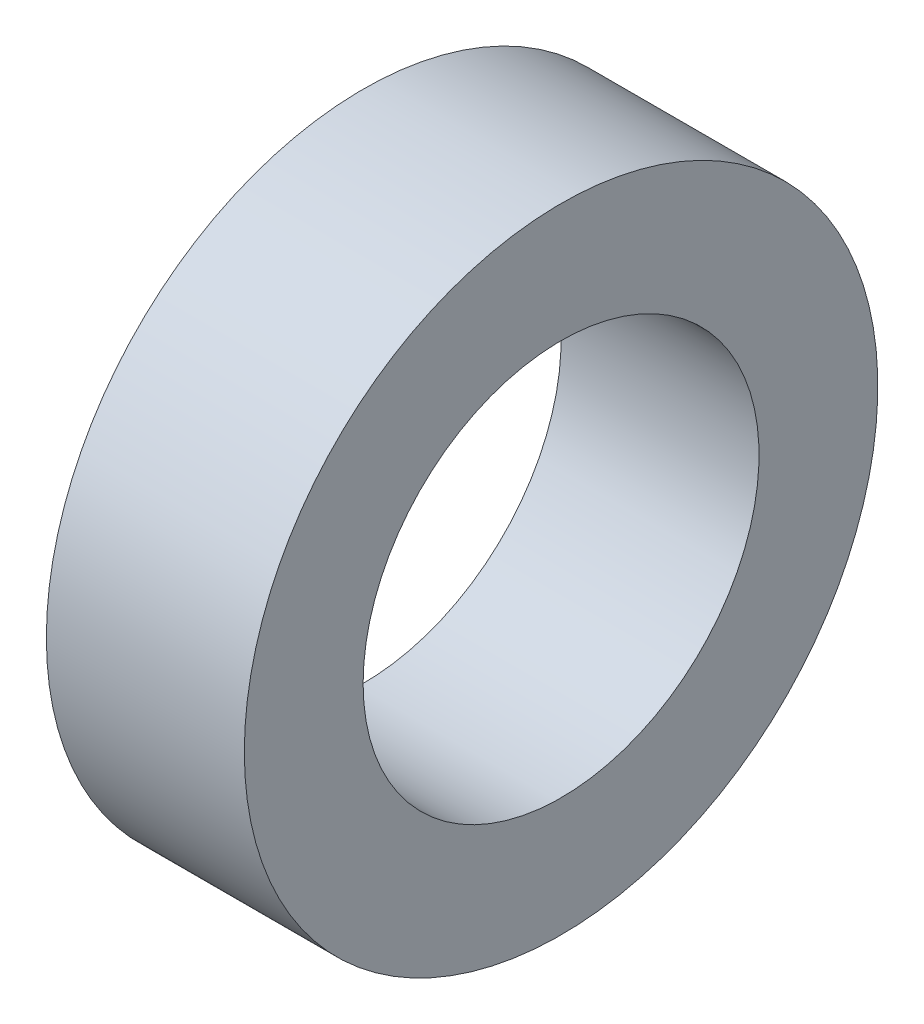
ISO-10303-21;
HEADER;
FILE_DESCRIPTION(('STEP AP214'),'2;1');
FILE_NAME('part.step','',(''),(''),'','','');
FILE_SCHEMA(('AUTOMOTIVE_DESIGN { 1 0 10303 214 1 1 1 1 }'));
ENDSEC;
DATA;
#1=APPLICATION_CONTEXT('core data for automotive mechanical design processes');
#2=APPLICATION_PROTOCOL_DEFINITION('international standard','automotive_design',2000,#1);
#3=PRODUCT_CONTEXT('',#1,'mechanical');
#4=PRODUCT('Part','Part','',(#3));
#5=PRODUCT_RELATED_PRODUCT_CATEGORY('part','',(#4));
#6=PRODUCT_DEFINITION_FORMATION('','',#4);
#7=PRODUCT_DEFINITION_CONTEXT('part definition',#1,'design');
#8=PRODUCT_DEFINITION('design','',#6,#7);
#9=PRODUCT_DEFINITION_SHAPE('','',#8);
#10=(LENGTH_UNIT() NAMED_UNIT(*) SI_UNIT(.MILLI.,.METRE.));
#11=(NAMED_UNIT(*) PLANE_ANGLE_UNIT() SI_UNIT($,.RADIAN.));
#12=(NAMED_UNIT(*) SI_UNIT($,.STERADIAN.) SOLID_ANGLE_UNIT());
#13=UNCERTAINTY_MEASURE_WITH_UNIT(LENGTH_MEASURE(1.E-05),#10,'distance_accuracy_value','');
#14=(GEOMETRIC_REPRESENTATION_CONTEXT(3) GLOBAL_UNCERTAINTY_ASSIGNED_CONTEXT((#13)) GLOBAL_UNIT_ASSIGNED_CONTEXT((#10,
#11,#12)) REPRESENTATION_CONTEXT('',''));
#15=CARTESIAN_POINT('',(0.,0.,0.));
#16=DIRECTION('',(0.,0.,1.));
#17=DIRECTION('',(1.,0.,0.));
#18=AXIS2_PLACEMENT_3D('',#15,#16,#17);
#19=CARTESIAN_POINT('',(0.,2.5,0.));
#20=DIRECTION('',(1.,0.,0.));
#21=DIRECTION('',(0.,0.,-1.));
#22=AXIS2_PLACEMENT_3D('',#19,#20,#21);
#23=PLANE('',#22);
#24=CARTESIAN_POINT('',(0.,0.,0.));
#25=DIRECTION('',(-1.,0.,0.));
#26=DIRECTION('',(0.,0.,1.));
#27=AXIS2_PLACEMENT_3D('',#24,#25,#26);
#28=CIRCLE('',#27,2.5);
#29=CARTESIAN_POINT('',(0.,0.,2.5));
#30=VERTEX_POINT('',#29);
#31=EDGE_CURVE('E49',#30,#30,#28,.T.);
#32=ORIENTED_EDGE('',*,*,#31,.F.);
#33=EDGE_LOOP('',(#32));
#34=FACE_BOUND('',#33,.T.);
#35=CARTESIAN_POINT('',(0.,0.,0.));
#36=DIRECTION('',(-1.,0.,0.));
#37=DIRECTION('',(0.,0.,1.));
#38=AXIS2_PLACEMENT_3D('',#35,#36,#37);
#39=CIRCLE('',#38,4.);
#40=CARTESIAN_POINT('',(0.,0.,4.));
#41=VERTEX_POINT('',#40);
#42=EDGE_CURVE('E10',#41,#41,#39,.T.);
#43=ORIENTED_EDGE('',*,*,#42,.T.);
#44=EDGE_LOOP('',(#43));
#45=FACE_BOUND('',#44,.T.);
#46=ADVANCED_FACE('F35',(#34,#45),#23,.F.);
#47=CARTESIAN_POINT('',(0.,0.,0.));
#48=DIRECTION('',(-1.,0.,0.));
#49=DIRECTION('',(0.,0.,1.));
#50=AXIS2_PLACEMENT_3D('',#47,#48,#49);
#51=CYLINDRICAL_SURFACE('',#50,4.);
#52=ORIENTED_EDGE('',*,*,#42,.F.);
#53=EDGE_LOOP('',(#52));
#54=FACE_BOUND('',#53,.T.);
#55=CARTESIAN_POINT('',(2.5,0.,0.));
#56=DIRECTION('',(-1.,0.,0.));
#57=DIRECTION('',(0.,0.,1.));
#58=AXIS2_PLACEMENT_3D('',#55,#56,#57);
#59=CIRCLE('',#58,4.);
#60=CARTESIAN_POINT('',(2.5,0.,4.));
#61=VERTEX_POINT('',#60);
#62=EDGE_CURVE('E41',#61,#61,#59,.T.);
#63=ORIENTED_EDGE('',*,*,#62,.T.);
#64=EDGE_LOOP('',(#63));
#65=FACE_BOUND('',#64,.T.);
#66=ADVANCED_FACE('F58',(#54,#65),#51,.T.);
#67=CARTESIAN_POINT('',(2.5,2.5,0.));
#68=DIRECTION('',(-1.,0.,0.));
#69=DIRECTION('',(0.,0.,1.));
#70=AXIS2_PLACEMENT_3D('',#67,#68,#69);
#71=PLANE('',#70);
#72=ORIENTED_EDGE('',*,*,#62,.F.);
#73=EDGE_LOOP('',(#72));
#74=FACE_BOUND('',#73,.T.);
#75=CARTESIAN_POINT('',(2.5,0.,0.));
#76=DIRECTION('',(-1.,0.,0.));
#77=DIRECTION('',(0.,0.,1.));
#78=AXIS2_PLACEMENT_3D('',#75,#76,#77);
#79=CIRCLE('',#78,2.5);
#80=CARTESIAN_POINT('',(2.5,0.,2.5));
#81=VERTEX_POINT('',#80);
#82=EDGE_CURVE('E45',#81,#81,#79,.T.);
#83=ORIENTED_EDGE('',*,*,#82,.T.);
#84=EDGE_LOOP('',(#83));
#85=FACE_BOUND('',#84,.T.);
#86=ADVANCED_FACE('F62',(#74,#85),#71,.F.);
#87=CARTESIAN_POINT('',(0.,0.,0.));
#88=DIRECTION('',(-1.,0.,0.));
#89=DIRECTION('',(0.,0.,1.));
#90=AXIS2_PLACEMENT_3D('',#87,#88,#89);
#91=CYLINDRICAL_SURFACE('',#90,2.5);
#92=ORIENTED_EDGE('',*,*,#82,.F.);
#93=EDGE_LOOP('',(#92));
#94=FACE_BOUND('',#93,.T.);
#95=ORIENTED_EDGE('',*,*,#31,.T.);
#96=EDGE_LOOP('',(#95));
#97=FACE_BOUND('',#96,.T.);
#98=ADVANCED_FACE('F55',(#94,#97),#91,.F.);
#99=CLOSED_SHELL('',(#46,#66,#86,#98));
#100=MANIFOLD_SOLID_BREP('B2',#99);
#101=ADVANCED_BREP_SHAPE_REPRESENTATION('',(#18,#100),#14);
#102=SHAPE_DEFINITION_REPRESENTATION(#9,#101);
ENDSEC;
END-ISO-10303-21;
